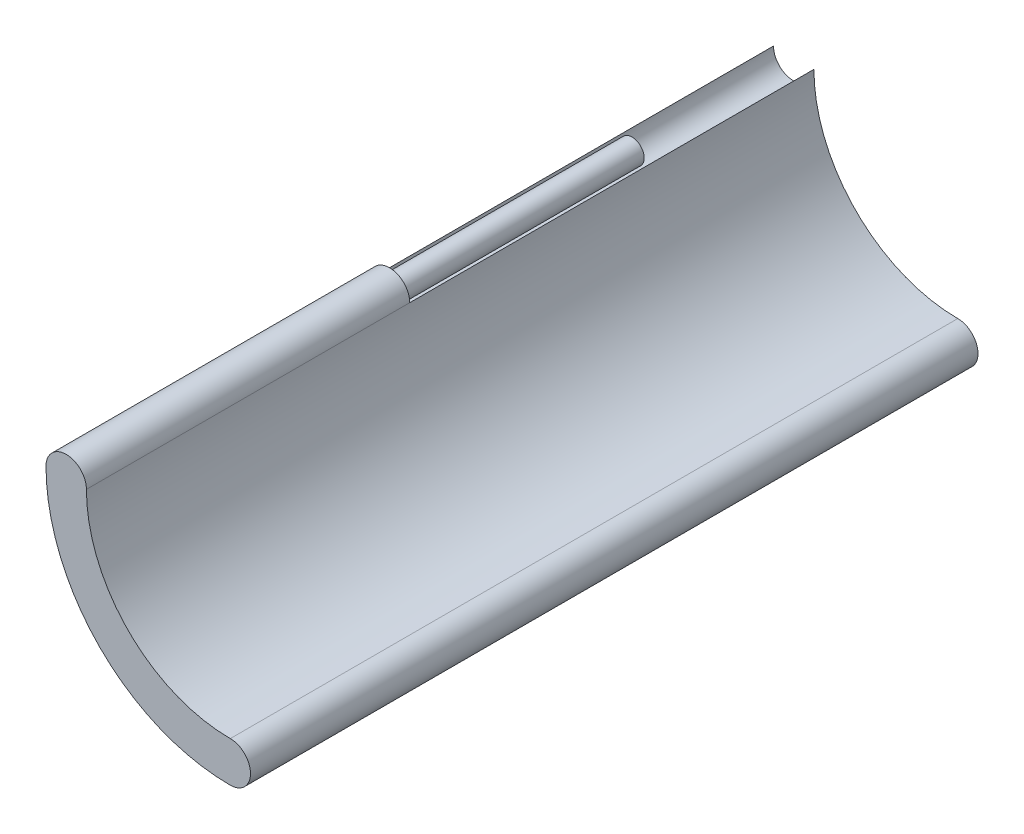
ISO-10303-21;
HEADER;
FILE_DESCRIPTION(('STEP AP214'),'2;1');
FILE_NAME('part.step','',(''),(''),'','','');
FILE_SCHEMA(('AUTOMOTIVE_DESIGN { 1 0 10303 214 1 1 1 1 }'));
ENDSEC;
DATA;
#1=APPLICATION_CONTEXT('core data for automotive mechanical design processes');
#2=APPLICATION_PROTOCOL_DEFINITION('international standard','automotive_design',2000,#1);
#3=PRODUCT_CONTEXT('',#1,'mechanical');
#4=PRODUCT('Part','Part','',(#3));
#5=PRODUCT_RELATED_PRODUCT_CATEGORY('part','',(#4));
#6=PRODUCT_DEFINITION_FORMATION('','',#4);
#7=PRODUCT_DEFINITION_CONTEXT('part definition',#1,'design');
#8=PRODUCT_DEFINITION('design','',#6,#7);
#9=PRODUCT_DEFINITION_SHAPE('','',#8);
#10=(LENGTH_UNIT() NAMED_UNIT(*) SI_UNIT(.MILLI.,.METRE.));
#11=(NAMED_UNIT(*) PLANE_ANGLE_UNIT() SI_UNIT($,.RADIAN.));
#12=(NAMED_UNIT(*) SI_UNIT($,.STERADIAN.) SOLID_ANGLE_UNIT());
#13=UNCERTAINTY_MEASURE_WITH_UNIT(LENGTH_MEASURE(1.E-05),#10,'distance_accuracy_value','');
#14=(GEOMETRIC_REPRESENTATION_CONTEXT(3) GLOBAL_UNCERTAINTY_ASSIGNED_CONTEXT((#13)) GLOBAL_UNIT_ASSIGNED_CONTEXT((#10,
#11,#12)) REPRESENTATION_CONTEXT('',''));
#15=CARTESIAN_POINT('',(0.,0.,0.));
#16=DIRECTION('',(0.,0.,1.));
#17=DIRECTION('',(1.,0.,0.));
#18=AXIS2_PLACEMENT_3D('',#15,#16,#17);
#19=CARTESIAN_POINT('',(-101.5,0.,-450.));
#20=DIRECTION('',(0.,0.,1.));
#21=DIRECTION('',(1.,0.,0.));
#22=AXIS2_PLACEMENT_3D('',#19,#20,#21);
#23=CYLINDRICAL_SURFACE('',#22,12.5);
#24=CARTESIAN_POINT('',(-101.5,0.,-200.));
#25=DIRECTION('',(0.,0.,1.));
#26=DIRECTION('',(1.,0.,0.));
#27=AXIS2_PLACEMENT_3D('',#24,#25,#26);
#28=CIRCLE('',#27,12.5);
#29=CARTESIAN_POINT('',(-114.,0.,-200.));
#30=VERTEX_POINT('',#29);
#31=CARTESIAN_POINT('',(-89.,0.,-200.));
#32=VERTEX_POINT('',#31);
#33=EDGE_CURVE('E60',#30,#32,#28,.T.);
#34=ORIENTED_EDGE('',*,*,#33,.T.);
#35=DIRECTION('',(0.,0.,1.));
#36=VECTOR('',#35,1.);
#37=CARTESIAN_POINT('',(-89.,0.,-450.));
#38=LINE('',#37,#36);
#39=CARTESIAN_POINT('',(-89.,0.,-450.));
#40=VERTEX_POINT('',#39);
#41=EDGE_CURVE('E11',#40,#32,#38,.T.);
#42=ORIENTED_EDGE('',*,*,#41,.F.);
#43=CARTESIAN_POINT('',(-101.5,0.,-450.));
#44=DIRECTION('',(0.,0.,1.));
#45=DIRECTION('',(1.,0.,0.));
#46=AXIS2_PLACEMENT_3D('',#43,#44,#45);
#47=CIRCLE('',#46,12.5);
#48=CARTESIAN_POINT('',(-114.,0.,-450.));
#49=VERTEX_POINT('',#48);
#50=EDGE_CURVE('E99',#49,#40,#47,.T.);
#51=ORIENTED_EDGE('',*,*,#50,.F.);
#52=DIRECTION('',(0.,0.,1.));
#53=VECTOR('',#52,1.);
#54=CARTESIAN_POINT('',(-114.,0.,-450.));
#55=LINE('',#54,#53);
#56=EDGE_CURVE('E42',#49,#30,#55,.T.);
#57=ORIENTED_EDGE('',*,*,#56,.T.);
#58=EDGE_LOOP('',(#34,#42,#51,#57));
#59=FACE_BOUND('',#58,.T.);
#60=ADVANCED_FACE('F41',(#59),#23,.F.);
#61=CARTESIAN_POINT('',(0.,0.,-450.));
#62=DIRECTION('',(0.,0.,1.));
#63=DIRECTION('',(1.,0.,0.));
#64=AXIS2_PLACEMENT_3D('',#61,#62,#63);
#65=CYLINDRICAL_SURFACE('',#64,89.);
#66=CARTESIAN_POINT('',(0.,0.,0.));
#67=DIRECTION('',(0.,0.,1.));
#68=DIRECTION('',(1.,0.,0.));
#69=AXIS2_PLACEMENT_3D('',#66,#67,#68);
#70=CIRCLE('',#69,89.);
#71=CARTESIAN_POINT('',(-89.,0.,0.));
#72=VERTEX_POINT('',#71);
#73=CARTESIAN_POINT('',(0.,-89.,0.));
#74=VERTEX_POINT('',#73);
#75=EDGE_CURVE('E89',#72,#74,#70,.T.);
#76=ORIENTED_EDGE('',*,*,#75,.T.);
#77=DIRECTION('',(0.,0.,1.));
#78=VECTOR('',#77,1.);
#79=CARTESIAN_POINT('',(0.,-89.,-450.));
#80=LINE('',#79,#78);
#81=CARTESIAN_POINT('',(0.,-89.,-450.));
#82=VERTEX_POINT('',#81);
#83=EDGE_CURVE('E47',#82,#74,#80,.T.);
#84=ORIENTED_EDGE('',*,*,#83,.F.);
#85=CARTESIAN_POINT('',(0.,0.,-450.));
#86=DIRECTION('',(0.,0.,1.));
#87=DIRECTION('',(1.,0.,0.));
#88=AXIS2_PLACEMENT_3D('',#85,#86,#87);
#89=CIRCLE('',#88,89.);
#90=EDGE_CURVE('E126',#40,#82,#89,.T.);
#91=ORIENTED_EDGE('',*,*,#90,.F.);
#92=ORIENTED_EDGE('',*,*,#41,.T.);
#93=DIRECTION('',(0.,0.,1.));
#94=VECTOR('',#93,1.);
#95=CARTESIAN_POINT('',(-89.,0.,-100.));
#96=LINE('',#95,#94);
#97=EDGE_CURVE('E103',#32,#72,#96,.T.);
#98=ORIENTED_EDGE('',*,*,#97,.T.);
#99=EDGE_LOOP('',(#76,#84,#91,#92,#98));
#100=FACE_BOUND('',#99,.T.);
#101=ADVANCED_FACE('F102',(#100),#65,.F.);
#102=CARTESIAN_POINT('',(0.,-101.5,-450.));
#103=DIRECTION('',(0.,0.,1.));
#104=DIRECTION('',(1.,0.,0.));
#105=AXIS2_PLACEMENT_3D('',#102,#103,#104);
#106=CYLINDRICAL_SURFACE('',#105,12.5);
#107=CARTESIAN_POINT('',(0.,-101.5,0.));
#108=DIRECTION('',(0.,0.,1.));
#109=DIRECTION('',(1.,0.,0.));
#110=AXIS2_PLACEMENT_3D('',#107,#108,#109);
#111=CIRCLE('',#110,12.5);
#112=CARTESIAN_POINT('',(0.,-114.,0.));
#113=VERTEX_POINT('',#112);
#114=EDGE_CURVE('E100',#113,#74,#111,.T.);
#115=ORIENTED_EDGE('',*,*,#114,.F.);
#116=DIRECTION('',(0.,0.,1.));
#117=VECTOR('',#116,1.);
#118=CARTESIAN_POINT('',(0.,-114.,-450.));
#119=LINE('',#118,#117);
#120=CARTESIAN_POINT('',(0.,-114.,-450.));
#121=VERTEX_POINT('',#120);
#122=EDGE_CURVE('E131',#121,#113,#119,.T.);
#123=ORIENTED_EDGE('',*,*,#122,.F.);
#124=CARTESIAN_POINT('',(0.,-101.5,-450.));
#125=DIRECTION('',(0.,0.,1.));
#126=DIRECTION('',(1.,0.,0.));
#127=AXIS2_PLACEMENT_3D('',#124,#125,#126);
#128=CIRCLE('',#127,12.5);
#129=EDGE_CURVE('E123',#121,#82,#128,.T.);
#130=ORIENTED_EDGE('',*,*,#129,.T.);
#131=ORIENTED_EDGE('',*,*,#83,.T.);
#132=EDGE_LOOP('',(#115,#123,#130,#131));
#133=FACE_BOUND('',#132,.T.);
#134=ADVANCED_FACE('F154',(#133),#106,.T.);
#135=CARTESIAN_POINT('',(0.,0.,-450.));
#136=DIRECTION('',(0.,0.,1.));
#137=DIRECTION('',(1.,0.,0.));
#138=AXIS2_PLACEMENT_3D('',#135,#136,#137);
#139=CYLINDRICAL_SURFACE('',#138,114.);
#140=CARTESIAN_POINT('',(0.,0.,0.));
#141=DIRECTION('',(0.,0.,1.));
#142=DIRECTION('',(1.,0.,0.));
#143=AXIS2_PLACEMENT_3D('',#140,#141,#142);
#144=CIRCLE('',#143,114.);
#145=CARTESIAN_POINT('',(-114.,0.,0.));
#146=VERTEX_POINT('',#145);
#147=EDGE_CURVE('E107',#146,#113,#144,.T.);
#148=ORIENTED_EDGE('',*,*,#147,.F.);
#149=DIRECTION('',(0.,0.,1.));
#150=VECTOR('',#149,1.);
#151=CARTESIAN_POINT('',(-114.,0.,-100.));
#152=LINE('',#151,#150);
#153=EDGE_CURVE('E63',#30,#146,#152,.T.);
#154=ORIENTED_EDGE('',*,*,#153,.F.);
#155=ORIENTED_EDGE('',*,*,#56,.F.);
#156=CARTESIAN_POINT('',(0.,0.,-450.));
#157=DIRECTION('',(0.,0.,1.));
#158=DIRECTION('',(1.,0.,0.));
#159=AXIS2_PLACEMENT_3D('',#156,#157,#158);
#160=CIRCLE('',#159,114.);
#161=EDGE_CURVE('E125',#49,#121,#160,.T.);
#162=ORIENTED_EDGE('',*,*,#161,.T.);
#163=ORIENTED_EDGE('',*,*,#122,.T.);
#164=EDGE_LOOP('',(#148,#154,#155,#162,#163));
#165=FACE_BOUND('',#164,.T.);
#166=ADVANCED_FACE('F161',(#165),#139,.T.);
#167=CARTESIAN_POINT('',(0.,0.,-450.));
#168=DIRECTION('',(0.,0.,1.));
#169=DIRECTION('',(1.,0.,0.));
#170=AXIS2_PLACEMENT_3D('',#167,#168,#169);
#171=PLANE('',#170);
#172=ORIENTED_EDGE('',*,*,#50,.T.);
#173=ORIENTED_EDGE('',*,*,#90,.T.);
#174=ORIENTED_EDGE('',*,*,#129,.F.);
#175=ORIENTED_EDGE('',*,*,#161,.F.);
#176=EDGE_LOOP('',(#172,#173,#174,#175));
#177=FACE_BOUND('',#176,.T.);
#178=ADVANCED_FACE('F167',(#177),#171,.F.);
#179=CARTESIAN_POINT('',(0.,0.,0.));
#180=DIRECTION('',(0.,0.,1.));
#181=DIRECTION('',(1.,0.,0.));
#182=AXIS2_PLACEMENT_3D('',#179,#180,#181);
#183=PLANE('',#182);
#184=ORIENTED_EDGE('',*,*,#75,.F.);
#185=CARTESIAN_POINT('',(-101.5,0.,0.));
#186=DIRECTION('',(0.,0.,1.));
#187=DIRECTION('',(1.,0.,0.));
#188=AXIS2_PLACEMENT_3D('',#185,#186,#187);
#189=CIRCLE('',#188,12.5);
#190=EDGE_CURVE('E92',#72,#146,#189,.T.);
#191=ORIENTED_EDGE('',*,*,#190,.T.);
#192=ORIENTED_EDGE('',*,*,#147,.T.);
#193=ORIENTED_EDGE('',*,*,#114,.T.);
#194=EDGE_LOOP('',(#184,#191,#192,#193));
#195=FACE_BOUND('',#194,.T.);
#196=ADVANCED_FACE('F95',(#195),#183,.T.);
#197=CARTESIAN_POINT('',(-101.5,0.,-200.));
#198=DIRECTION('',(0.,0.,1.));
#199=DIRECTION('',(1.,0.,0.));
#200=AXIS2_PLACEMENT_3D('',#197,#198,#199);
#201=CYLINDRICAL_SURFACE('',#200,12.5);
#202=ORIENTED_EDGE('',*,*,#97,.F.);
#203=EDGE_CURVE('E114',#32,#30,#28,.T.);
#204=ORIENTED_EDGE('',*,*,#203,.T.);
#205=ORIENTED_EDGE('',*,*,#153,.T.);
#206=ORIENTED_EDGE('',*,*,#190,.F.);
#207=EDGE_LOOP('',(#202,#204,#205,#206));
#208=FACE_BOUND('',#207,.T.);
#209=ADVANCED_FACE('F109',(#208),#201,.T.);
#210=CARTESIAN_POINT('',(0.,0.,-200.));
#211=DIRECTION('',(0.,0.,1.));
#212=DIRECTION('',(1.,0.,0.));
#213=AXIS2_PLACEMENT_3D('',#210,#211,#212);
#214=PLANE('',#213);
#215=CARTESIAN_POINT('',(-101.5,0.,-200.));
#216=DIRECTION('',(0.,0.,1.));
#217=DIRECTION('',(1.,0.,0.));
#218=AXIS2_PLACEMENT_3D('',#215,#216,#217);
#219=CIRCLE('',#218,7.50000000000001);
#220=CARTESIAN_POINT('',(-94.,0.,-200.));
#221=VERTEX_POINT('',#220);
#222=EDGE_CURVE('E112',#221,#221,#219,.T.);
#223=ORIENTED_EDGE('',*,*,#222,.T.);
#224=EDGE_LOOP('',(#223));
#225=FACE_BOUND('',#224,.T.);
#226=ORIENTED_EDGE('',*,*,#203,.F.);
#227=ORIENTED_EDGE('',*,*,#33,.F.);
#228=EDGE_LOOP('',(#226,#227));
#229=FACE_BOUND('',#228,.T.);
#230=ADVANCED_FACE('F137',(#225,#229),#214,.F.);
#231=CARTESIAN_POINT('',(0.,0.,-350.));
#232=DIRECTION('',(0.,0.,1.));
#233=DIRECTION('',(1.,0.,0.));
#234=AXIS2_PLACEMENT_3D('',#231,#232,#233);
#235=PLANE('',#234);
#236=CARTESIAN_POINT('',(-101.5,0.,-350.));
#237=DIRECTION('',(0.,0.,1.));
#238=DIRECTION('',(1.,0.,0.));
#239=AXIS2_PLACEMENT_3D('',#236,#237,#238);
#240=CIRCLE('',#239,7.50000000000001);
#241=CARTESIAN_POINT('',(-94.,0.,-350.));
#242=VERTEX_POINT('',#241);
#243=EDGE_CURVE('E119',#242,#242,#240,.T.);
#244=ORIENTED_EDGE('',*,*,#243,.F.);
#245=EDGE_LOOP('',(#244));
#246=FACE_BOUND('',#245,.T.);
#247=ADVANCED_FACE('F139',(#246),#235,.F.);
#248=CARTESIAN_POINT('',(-101.5,0.,-350.));
#249=DIRECTION('',(0.,0.,1.));
#250=DIRECTION('',(1.,0.,0.));
#251=AXIS2_PLACEMENT_3D('',#248,#249,#250);
#252=CYLINDRICAL_SURFACE('',#251,7.50000000000001);
#253=ORIENTED_EDGE('',*,*,#243,.T.);
#254=EDGE_LOOP('',(#253));
#255=FACE_BOUND('',#254,.T.);
#256=ORIENTED_EDGE('',*,*,#222,.F.);
#257=EDGE_LOOP('',(#256));
#258=FACE_BOUND('',#257,.T.);
#259=ADVANCED_FACE('F144',(#255,#258),#252,.T.);
#260=CLOSED_SHELL('',(#60,#101,#134,#166,#178,#196,#209,#230,#247,#259));
#261=MANIFOLD_SOLID_BREP('B2',#260);
#262=ADVANCED_BREP_SHAPE_REPRESENTATION('',(#18,#261),#14);
#263=SHAPE_DEFINITION_REPRESENTATION(#9,#262);
ENDSEC;
END-ISO-10303-21;
